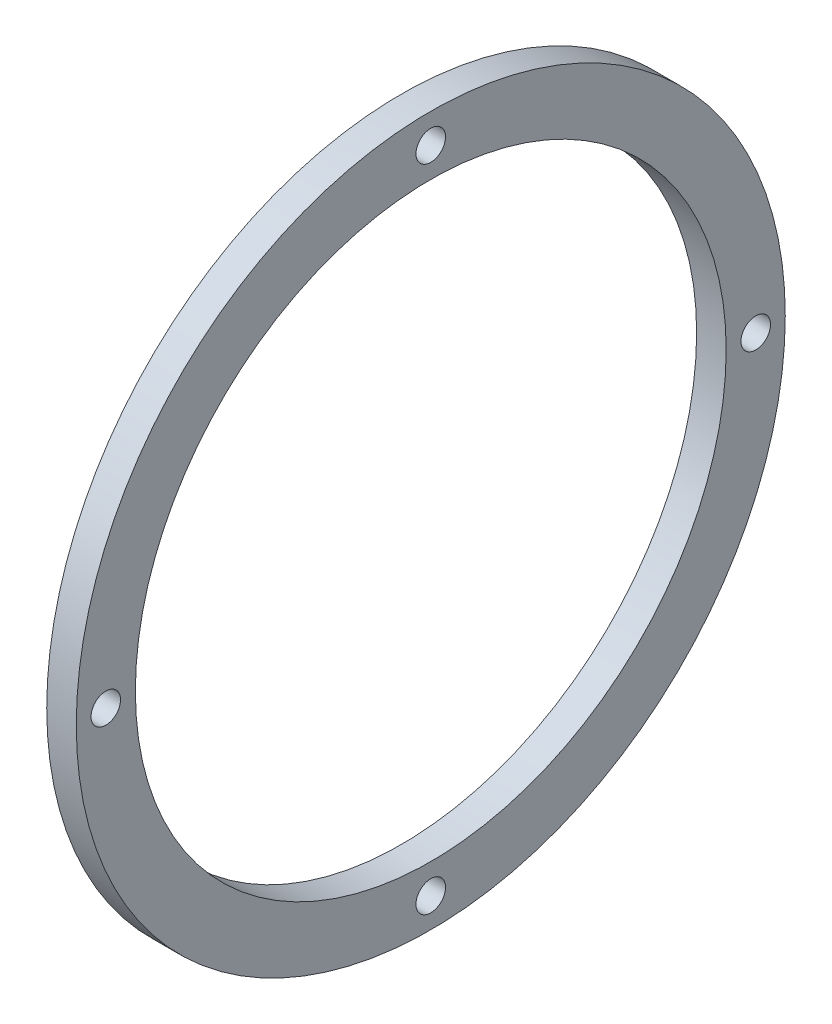
ISO-10303-21;
HEADER;
FILE_DESCRIPTION(('STEP AP214'),'2;1');
FILE_NAME('part.step','',(''),(''),'','','');
FILE_SCHEMA(('AUTOMOTIVE_DESIGN { 1 0 10303 214 1 1 1 1 }'));
ENDSEC;
DATA;
#1=APPLICATION_CONTEXT('core data for automotive mechanical design processes');
#2=APPLICATION_PROTOCOL_DEFINITION('international standard','automotive_design',2000,#1);
#3=PRODUCT_CONTEXT('',#1,'mechanical');
#4=PRODUCT('Part','Part','',(#3));
#5=PRODUCT_RELATED_PRODUCT_CATEGORY('part','',(#4));
#6=PRODUCT_DEFINITION_FORMATION('','',#4);
#7=PRODUCT_DEFINITION_CONTEXT('part definition',#1,'design');
#8=PRODUCT_DEFINITION('design','',#6,#7);
#9=PRODUCT_DEFINITION_SHAPE('','',#8);
#10=(LENGTH_UNIT() NAMED_UNIT(*) SI_UNIT(.MILLI.,.METRE.));
#11=(NAMED_UNIT(*) PLANE_ANGLE_UNIT() SI_UNIT($,.RADIAN.));
#12=(NAMED_UNIT(*) SI_UNIT($,.STERADIAN.) SOLID_ANGLE_UNIT());
#13=UNCERTAINTY_MEASURE_WITH_UNIT(LENGTH_MEASURE(1.E-05),#10,'distance_accuracy_value','');
#14=(GEOMETRIC_REPRESENTATION_CONTEXT(3) GLOBAL_UNCERTAINTY_ASSIGNED_CONTEXT((#13)) GLOBAL_UNIT_ASSIGNED_CONTEXT((#10,
#11,#12)) REPRESENTATION_CONTEXT('',''));
#15=CARTESIAN_POINT('',(0.,0.,0.));
#16=DIRECTION('',(0.,0.,1.));
#17=DIRECTION('',(1.,0.,0.));
#18=AXIS2_PLACEMENT_3D('',#15,#16,#17);
#19=CARTESIAN_POINT('',(3.175,0.,0.));
#20=DIRECTION('',(1.,0.,0.));
#21=DIRECTION('',(0.,0.,-1.));
#22=AXIS2_PLACEMENT_3D('',#19,#20,#21);
#23=PLANE('',#22);
#24=CARTESIAN_POINT('',(3.175,0.,34.925));
#25=DIRECTION('',(1.,0.,0.));
#26=DIRECTION('',(0.,0.,-1.));
#27=AXIS2_PLACEMENT_3D('',#24,#25,#26);
#28=CIRCLE('',#27,1.5875);
#29=CARTESIAN_POINT('',(3.175,0.,33.3375));
#30=VERTEX_POINT('',#29);
#31=EDGE_CURVE('E72',#30,#30,#28,.T.);
#32=ORIENTED_EDGE('',*,*,#31,.F.);
#33=EDGE_LOOP('',(#32));
#34=FACE_BOUND('',#33,.T.);
#35=CARTESIAN_POINT('',(3.175,0.,0.));
#36=DIRECTION('',(1.,0.,0.));
#37=DIRECTION('',(0.,0.,-1.));
#38=AXIS2_PLACEMENT_3D('',#35,#36,#37);
#39=CIRCLE('',#38,31.75);
#40=CARTESIAN_POINT('',(3.175,0.,-31.75));
#41=VERTEX_POINT('',#40);
#42=EDGE_CURVE('E56',#41,#41,#39,.T.);
#43=ORIENTED_EDGE('',*,*,#42,.F.);
#44=EDGE_LOOP('',(#43));
#45=FACE_BOUND('',#44,.T.);
#46=CARTESIAN_POINT('',(3.175,0.,0.));
#47=DIRECTION('',(1.,0.,0.));
#48=DIRECTION('',(0.,0.,-1.));
#49=AXIS2_PLACEMENT_3D('',#46,#47,#48);
#50=CIRCLE('',#49,38.1);
#51=CARTESIAN_POINT('',(3.175,0.,-38.1));
#52=VERTEX_POINT('',#51);
#53=EDGE_CURVE('E10',#52,#52,#50,.T.);
#54=ORIENTED_EDGE('',*,*,#53,.T.);
#55=EDGE_LOOP('',(#54));
#56=FACE_BOUND('',#55,.T.);
#57=CARTESIAN_POINT('',(3.175,0.,-34.925));
#58=DIRECTION('',(1.,0.,0.));
#59=DIRECTION('',(0.,0.,-1.));
#60=AXIS2_PLACEMENT_3D('',#57,#58,#59);
#61=CIRCLE('',#60,1.5875);
#62=CARTESIAN_POINT('',(3.175,0.,-36.5125));
#63=VERTEX_POINT('',#62);
#64=EDGE_CURVE('E50',#63,#63,#61,.T.);
#65=ORIENTED_EDGE('',*,*,#64,.F.);
#66=EDGE_LOOP('',(#65));
#67=FACE_BOUND('',#66,.T.);
#68=CARTESIAN_POINT('',(3.175,-34.925,0.));
#69=DIRECTION('',(1.,0.,0.));
#70=DIRECTION('',(0.,0.,-1.));
#71=AXIS2_PLACEMENT_3D('',#68,#69,#70);
#72=CIRCLE('',#71,1.5875);
#73=CARTESIAN_POINT('',(3.175,-34.925,-1.5875));
#74=VERTEX_POINT('',#73);
#75=EDGE_CURVE('E64',#74,#74,#72,.T.);
#76=ORIENTED_EDGE('',*,*,#75,.F.);
#77=EDGE_LOOP('',(#76));
#78=FACE_BOUND('',#77,.T.);
#79=CARTESIAN_POINT('',(3.175,34.925,0.));
#80=DIRECTION('',(1.,0.,0.));
#81=DIRECTION('',(0.,0.,-1.));
#82=AXIS2_PLACEMENT_3D('',#79,#80,#81);
#83=CIRCLE('',#82,1.5875);
#84=CARTESIAN_POINT('',(3.175,34.925,-1.58749999999999));
#85=VERTEX_POINT('',#84);
#86=EDGE_CURVE('E80',#85,#85,#83,.T.);
#87=ORIENTED_EDGE('',*,*,#86,.F.);
#88=EDGE_LOOP('',(#87));
#89=FACE_BOUND('',#88,.T.);
#90=ADVANCED_FACE('F37',(#34,#45,#56,#67,#78,#89),#23,.T.);
#91=CARTESIAN_POINT('',(0.,0.,0.));
#92=DIRECTION('',(1.,0.,0.));
#93=DIRECTION('',(0.,0.,-1.));
#94=AXIS2_PLACEMENT_3D('',#91,#92,#93);
#95=PLANE('',#94);
#96=CARTESIAN_POINT('',(0.,0.,0.));
#97=DIRECTION('',(1.,0.,0.));
#98=DIRECTION('',(0.,0.,-1.));
#99=AXIS2_PLACEMENT_3D('',#96,#97,#98);
#100=CIRCLE('',#99,38.1);
#101=CARTESIAN_POINT('',(0.,0.,-38.1));
#102=VERTEX_POINT('',#101);
#103=EDGE_CURVE('E41',#102,#102,#100,.T.);
#104=ORIENTED_EDGE('',*,*,#103,.F.);
#105=EDGE_LOOP('',(#104));
#106=FACE_BOUND('',#105,.T.);
#107=CARTESIAN_POINT('',(0.,0.,-34.925));
#108=DIRECTION('',(1.,0.,0.));
#109=DIRECTION('',(0.,0.,-1.));
#110=AXIS2_PLACEMENT_3D('',#107,#108,#109);
#111=CIRCLE('',#110,1.5875);
#112=CARTESIAN_POINT('',(0.,0.,-36.5125));
#113=VERTEX_POINT('',#112);
#114=EDGE_CURVE('E52',#113,#113,#111,.T.);
#115=ORIENTED_EDGE('',*,*,#114,.T.);
#116=EDGE_LOOP('',(#115));
#117=FACE_BOUND('',#116,.T.);
#118=CARTESIAN_POINT('',(0.,0.,0.));
#119=DIRECTION('',(1.,0.,0.));
#120=DIRECTION('',(0.,0.,-1.));
#121=AXIS2_PLACEMENT_3D('',#118,#119,#120);
#122=CIRCLE('',#121,31.75);
#123=CARTESIAN_POINT('',(0.,0.,-31.75));
#124=VERTEX_POINT('',#123);
#125=EDGE_CURVE('E60',#124,#124,#122,.T.);
#126=ORIENTED_EDGE('',*,*,#125,.T.);
#127=EDGE_LOOP('',(#126));
#128=FACE_BOUND('',#127,.T.);
#129=CARTESIAN_POINT('',(0.,-34.925,0.));
#130=DIRECTION('',(1.,0.,0.));
#131=DIRECTION('',(0.,0.,-1.));
#132=AXIS2_PLACEMENT_3D('',#129,#130,#131);
#133=CIRCLE('',#132,1.5875);
#134=CARTESIAN_POINT('',(0.,-34.925,-1.5875));
#135=VERTEX_POINT('',#134);
#136=EDGE_CURVE('E68',#135,#135,#133,.T.);
#137=ORIENTED_EDGE('',*,*,#136,.T.);
#138=EDGE_LOOP('',(#137));
#139=FACE_BOUND('',#138,.T.);
#140=CARTESIAN_POINT('',(0.,0.,34.925));
#141=DIRECTION('',(1.,0.,0.));
#142=DIRECTION('',(0.,0.,-1.));
#143=AXIS2_PLACEMENT_3D('',#140,#141,#142);
#144=CIRCLE('',#143,1.5875);
#145=CARTESIAN_POINT('',(0.,0.,33.3375));
#146=VERTEX_POINT('',#145);
#147=EDGE_CURVE('E76',#146,#146,#144,.T.);
#148=ORIENTED_EDGE('',*,*,#147,.T.);
#149=EDGE_LOOP('',(#148));
#150=FACE_BOUND('',#149,.T.);
#151=CARTESIAN_POINT('',(0.,34.925,0.));
#152=DIRECTION('',(1.,0.,0.));
#153=DIRECTION('',(0.,0.,-1.));
#154=AXIS2_PLACEMENT_3D('',#151,#152,#153);
#155=CIRCLE('',#154,1.5875);
#156=CARTESIAN_POINT('',(0.,34.925,-1.58749999999999));
#157=VERTEX_POINT('',#156);
#158=EDGE_CURVE('E84',#157,#157,#155,.T.);
#159=ORIENTED_EDGE('',*,*,#158,.T.);
#160=EDGE_LOOP('',(#159));
#161=FACE_BOUND('',#160,.T.);
#162=ADVANCED_FACE('F96',(#106,#117,#128,#139,#150,#161),#95,.F.);
#163=CARTESIAN_POINT('',(3.175,0.,0.));
#164=DIRECTION('',(-1.,0.,0.));
#165=DIRECTION('',(0.,0.,1.));
#166=AXIS2_PLACEMENT_3D('',#163,#164,#165);
#167=CYLINDRICAL_SURFACE('',#166,38.1);
#168=ORIENTED_EDGE('',*,*,#53,.F.);
#169=EDGE_LOOP('',(#168));
#170=FACE_BOUND('',#169,.T.);
#171=ORIENTED_EDGE('',*,*,#103,.T.);
#172=EDGE_LOOP('',(#171));
#173=FACE_BOUND('',#172,.T.);
#174=ADVANCED_FACE('F39',(#170,#173),#167,.T.);
#175=CARTESIAN_POINT('',(3.175,0.,-34.925));
#176=DIRECTION('',(-1.,0.,0.));
#177=DIRECTION('',(0.,0.,1.));
#178=AXIS2_PLACEMENT_3D('',#175,#176,#177);
#179=CYLINDRICAL_SURFACE('',#178,1.5875);
#180=ORIENTED_EDGE('',*,*,#64,.T.);
#181=EDGE_LOOP('',(#180));
#182=FACE_BOUND('',#181,.T.);
#183=ORIENTED_EDGE('',*,*,#114,.F.);
#184=EDGE_LOOP('',(#183));
#185=FACE_BOUND('',#184,.T.);
#186=ADVANCED_FACE('F106',(#182,#185),#179,.F.);
#187=CARTESIAN_POINT('',(3.175,0.,0.));
#188=DIRECTION('',(-1.,0.,0.));
#189=DIRECTION('',(0.,0.,1.));
#190=AXIS2_PLACEMENT_3D('',#187,#188,#189);
#191=CYLINDRICAL_SURFACE('',#190,31.75);
#192=ORIENTED_EDGE('',*,*,#42,.T.);
#193=EDGE_LOOP('',(#192));
#194=FACE_BOUND('',#193,.T.);
#195=ORIENTED_EDGE('',*,*,#125,.F.);
#196=EDGE_LOOP('',(#195));
#197=FACE_BOUND('',#196,.T.);
#198=ADVANCED_FACE('F109',(#194,#197),#191,.F.);
#199=CARTESIAN_POINT('',(3.175,-34.925,0.));
#200=DIRECTION('',(-1.,0.,0.));
#201=DIRECTION('',(0.,0.,1.));
#202=AXIS2_PLACEMENT_3D('',#199,#200,#201);
#203=CYLINDRICAL_SURFACE('',#202,1.5875);
#204=ORIENTED_EDGE('',*,*,#75,.T.);
#205=EDGE_LOOP('',(#204));
#206=FACE_BOUND('',#205,.T.);
#207=ORIENTED_EDGE('',*,*,#136,.F.);
#208=EDGE_LOOP('',(#207));
#209=FACE_BOUND('',#208,.T.);
#210=ADVANCED_FACE('F113',(#206,#209),#203,.F.);
#211=CARTESIAN_POINT('',(3.175,0.,34.925));
#212=DIRECTION('',(-1.,0.,0.));
#213=DIRECTION('',(0.,0.,1.));
#214=AXIS2_PLACEMENT_3D('',#211,#212,#213);
#215=CYLINDRICAL_SURFACE('',#214,1.5875);
#216=ORIENTED_EDGE('',*,*,#31,.T.);
#217=EDGE_LOOP('',(#216));
#218=FACE_BOUND('',#217,.T.);
#219=ORIENTED_EDGE('',*,*,#147,.F.);
#220=EDGE_LOOP('',(#219));
#221=FACE_BOUND('',#220,.T.);
#222=ADVANCED_FACE('F117',(#218,#221),#215,.F.);
#223=CARTESIAN_POINT('',(3.175,34.925,0.));
#224=DIRECTION('',(-1.,0.,0.));
#225=DIRECTION('',(0.,0.,1.));
#226=AXIS2_PLACEMENT_3D('',#223,#224,#225);
#227=CYLINDRICAL_SURFACE('',#226,1.5875);
#228=ORIENTED_EDGE('',*,*,#86,.T.);
#229=EDGE_LOOP('',(#228));
#230=FACE_BOUND('',#229,.T.);
#231=ORIENTED_EDGE('',*,*,#158,.F.);
#232=EDGE_LOOP('',(#231));
#233=FACE_BOUND('',#232,.T.);
#234=ADVANCED_FACE('F92',(#230,#233),#227,.F.);
#235=CLOSED_SHELL('',(#90,#162,#174,#186,#198,#210,#222,#234));
#236=MANIFOLD_SOLID_BREP('B2',#235);
#237=ADVANCED_BREP_SHAPE_REPRESENTATION('',(#18,#236),#14);
#238=SHAPE_DEFINITION_REPRESENTATION(#9,#237);
ENDSEC;
END-ISO-10303-21;
